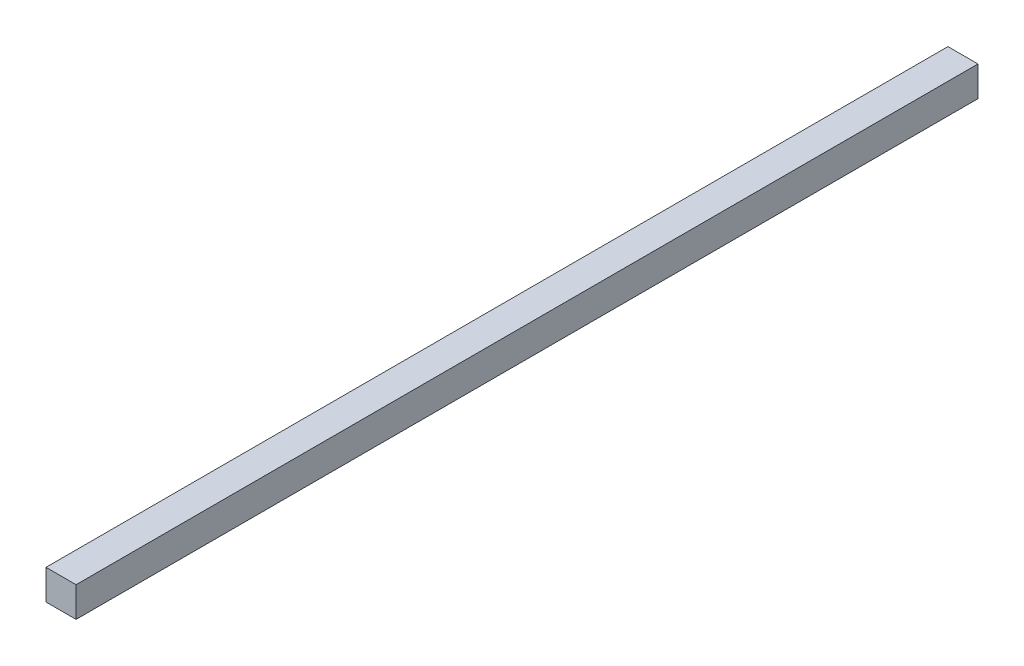
ISO-10303-21;
HEADER;
FILE_DESCRIPTION(('STEP AP214'),'2;1');
FILE_NAME('part.step','',(''),(''),'','','');
FILE_SCHEMA(('AUTOMOTIVE_DESIGN { 1 0 10303 214 1 1 1 1 }'));
ENDSEC;
DATA;
#1=APPLICATION_CONTEXT('core data for automotive mechanical design processes');
#2=APPLICATION_PROTOCOL_DEFINITION('international standard','automotive_design',2000,#1);
#3=PRODUCT_CONTEXT('',#1,'mechanical');
#4=PRODUCT('Part','Part','',(#3));
#5=PRODUCT_RELATED_PRODUCT_CATEGORY('part','',(#4));
#6=PRODUCT_DEFINITION_FORMATION('','',#4);
#7=PRODUCT_DEFINITION_CONTEXT('part definition',#1,'design');
#8=PRODUCT_DEFINITION('design','',#6,#7);
#9=PRODUCT_DEFINITION_SHAPE('','',#8);
#10=(LENGTH_UNIT() NAMED_UNIT(*) SI_UNIT(.MILLI.,.METRE.));
#11=(NAMED_UNIT(*) PLANE_ANGLE_UNIT() SI_UNIT($,.RADIAN.));
#12=(NAMED_UNIT(*) SI_UNIT($,.STERADIAN.) SOLID_ANGLE_UNIT());
#13=UNCERTAINTY_MEASURE_WITH_UNIT(LENGTH_MEASURE(1.E-05),#10,'distance_accuracy_value','');
#14=(GEOMETRIC_REPRESENTATION_CONTEXT(3) GLOBAL_UNCERTAINTY_ASSIGNED_CONTEXT((#13)) GLOBAL_UNIT_ASSIGNED_CONTEXT((#10,
#11,#12)) REPRESENTATION_CONTEXT('',''));
#15=CARTESIAN_POINT('',(0.,0.,0.));
#16=DIRECTION('',(0.,0.,1.));
#17=DIRECTION('',(1.,0.,0.));
#18=AXIS2_PLACEMENT_3D('',#15,#16,#17);
#19=CARTESIAN_POINT('',(0.,0.,600.));
#20=DIRECTION('',(1.,0.,0.));
#21=DIRECTION('',(0.,0.,-1.));
#22=AXIS2_PLACEMENT_3D('',#19,#20,#21);
#23=PLANE('',#22);
#24=DIRECTION('',(0.,-1.,0.));
#25=VECTOR('',#24,1.);
#26=CARTESIAN_POINT('',(0.,0.,0.));
#27=LINE('',#26,#25);
#28=CARTESIAN_POINT('',(0.,0.,0.));
#29=VERTEX_POINT('',#28);
#30=CARTESIAN_POINT('',(0.,-20.,0.));
#31=VERTEX_POINT('',#30);
#32=EDGE_CURVE('E95',#29,#31,#27,.T.);
#33=ORIENTED_EDGE('',*,*,#32,.T.);
#34=DIRECTION('',(0.,0.,-1.));
#35=VECTOR('',#34,1.);
#36=CARTESIAN_POINT('',(0.,-20.,600.));
#37=LINE('',#36,#35);
#38=CARTESIAN_POINT('',(0.,-20.,600.));
#39=VERTEX_POINT('',#38);
#40=EDGE_CURVE('E11',#39,#31,#37,.T.);
#41=ORIENTED_EDGE('',*,*,#40,.F.);
#42=DIRECTION('',(0.,-1.,0.));
#43=VECTOR('',#42,1.);
#44=CARTESIAN_POINT('',(0.,0.,600.));
#45=LINE('',#44,#43);
#46=CARTESIAN_POINT('',(0.,0.,600.));
#47=VERTEX_POINT('',#46);
#48=EDGE_CURVE('E83',#47,#39,#45,.T.);
#49=ORIENTED_EDGE('',*,*,#48,.F.);
#50=DIRECTION('',(0.,0.,-1.));
#51=VECTOR('',#50,1.);
#52=CARTESIAN_POINT('',(0.,0.,600.));
#53=LINE('',#52,#51);
#54=EDGE_CURVE('E91',#47,#29,#53,.T.);
#55=ORIENTED_EDGE('',*,*,#54,.T.);
#56=EDGE_LOOP('',(#33,#41,#49,#55));
#57=FACE_BOUND('',#56,.T.);
#58=ADVANCED_FACE('F32',(#57),#23,.F.);
#59=CARTESIAN_POINT('',(0.,-20.,600.));
#60=DIRECTION('',(0.,1.,0.));
#61=DIRECTION('',(0.,0.,1.));
#62=AXIS2_PLACEMENT_3D('',#59,#60,#61);
#63=PLANE('',#62);
#64=DIRECTION('',(1.,0.,0.));
#65=VECTOR('',#64,1.);
#66=CARTESIAN_POINT('',(0.,-20.,0.));
#67=LINE('',#66,#65);
#68=CARTESIAN_POINT('',(20.,-20.,0.));
#69=VERTEX_POINT('',#68);
#70=EDGE_CURVE('E87',#31,#69,#67,.T.);
#71=ORIENTED_EDGE('',*,*,#70,.T.);
#72=DIRECTION('',(0.,0.,-1.));
#73=VECTOR('',#72,1.);
#74=CARTESIAN_POINT('',(20.,-20.,600.));
#75=LINE('',#74,#73);
#76=CARTESIAN_POINT('',(20.,-20.,600.));
#77=VERTEX_POINT('',#76);
#78=EDGE_CURVE('E40',#77,#69,#75,.T.);
#79=ORIENTED_EDGE('',*,*,#78,.F.);
#80=DIRECTION('',(1.,0.,0.));
#81=VECTOR('',#80,1.);
#82=CARTESIAN_POINT('',(0.,-20.,600.));
#83=LINE('',#82,#81);
#84=EDGE_CURVE('E78',#39,#77,#83,.T.);
#85=ORIENTED_EDGE('',*,*,#84,.F.);
#86=ORIENTED_EDGE('',*,*,#40,.T.);
#87=EDGE_LOOP('',(#71,#79,#85,#86));
#88=FACE_BOUND('',#87,.T.);
#89=ADVANCED_FACE('F86',(#88),#63,.F.);
#90=CARTESIAN_POINT('',(20.,0.,600.));
#91=DIRECTION('',(-1.,0.,0.));
#92=DIRECTION('',(0.,-1.,0.));
#93=AXIS2_PLACEMENT_3D('',#90,#91,#92);
#94=PLANE('',#93);
#95=DIRECTION('',(0.,1.,0.));
#96=VECTOR('',#95,1.);
#97=CARTESIAN_POINT('',(20.,0.,0.));
#98=LINE('',#97,#96);
#99=CARTESIAN_POINT('',(20.,0.,0.));
#100=VERTEX_POINT('',#99);
#101=EDGE_CURVE('E65',#69,#100,#98,.T.);
#102=ORIENTED_EDGE('',*,*,#101,.T.);
#103=DIRECTION('',(0.,0.,-1.));
#104=VECTOR('',#103,1.);
#105=CARTESIAN_POINT('',(20.,0.,600.));
#106=LINE('',#105,#104);
#107=CARTESIAN_POINT('',(20.,0.,600.));
#108=VERTEX_POINT('',#107);
#109=EDGE_CURVE('E88',#108,#100,#106,.T.);
#110=ORIENTED_EDGE('',*,*,#109,.F.);
#111=DIRECTION('',(0.,1.,0.));
#112=VECTOR('',#111,1.);
#113=CARTESIAN_POINT('',(20.,0.,600.));
#114=LINE('',#113,#112);
#115=EDGE_CURVE('E81',#77,#108,#114,.T.);
#116=ORIENTED_EDGE('',*,*,#115,.F.);
#117=ORIENTED_EDGE('',*,*,#78,.T.);
#118=EDGE_LOOP('',(#102,#110,#116,#117));
#119=FACE_BOUND('',#118,.T.);
#120=ADVANCED_FACE('F89',(#119),#94,.F.);
#121=CARTESIAN_POINT('',(0.,0.,600.));
#122=DIRECTION('',(0.,-1.,0.));
#123=DIRECTION('',(0.,0.,-1.));
#124=AXIS2_PLACEMENT_3D('',#121,#122,#123);
#125=PLANE('',#124);
#126=DIRECTION('',(-1.,0.,0.));
#127=VECTOR('',#126,1.);
#128=CARTESIAN_POINT('',(0.,0.,0.));
#129=LINE('',#128,#127);
#130=EDGE_CURVE('E71',#100,#29,#129,.T.);
#131=ORIENTED_EDGE('',*,*,#130,.T.);
#132=ORIENTED_EDGE('',*,*,#54,.F.);
#133=DIRECTION('',(-1.,0.,0.));
#134=VECTOR('',#133,1.);
#135=CARTESIAN_POINT('',(0.,0.,600.));
#136=LINE('',#135,#134);
#137=EDGE_CURVE('E48',#108,#47,#136,.T.);
#138=ORIENTED_EDGE('',*,*,#137,.F.);
#139=ORIENTED_EDGE('',*,*,#109,.T.);
#140=EDGE_LOOP('',(#131,#132,#138,#139));
#141=FACE_BOUND('',#140,.T.);
#142=ADVANCED_FACE('F102',(#141),#125,.F.);
#143=CARTESIAN_POINT('',(0.,0.,600.));
#144=DIRECTION('',(0.,0.,1.));
#145=DIRECTION('',(1.,0.,0.));
#146=AXIS2_PLACEMENT_3D('',#143,#144,#145);
#147=PLANE('',#146);
#148=ORIENTED_EDGE('',*,*,#48,.T.);
#149=ORIENTED_EDGE('',*,*,#84,.T.);
#150=ORIENTED_EDGE('',*,*,#115,.T.);
#151=ORIENTED_EDGE('',*,*,#137,.T.);
#152=EDGE_LOOP('',(#148,#149,#150,#151));
#153=FACE_BOUND('',#152,.T.);
#154=ADVANCED_FACE('F79',(#153),#147,.T.);
#155=CARTESIAN_POINT('',(0.,0.,0.));
#156=DIRECTION('',(0.,0.,1.));
#157=DIRECTION('',(1.,0.,0.));
#158=AXIS2_PLACEMENT_3D('',#155,#156,#157);
#159=PLANE('',#158);
#160=ORIENTED_EDGE('',*,*,#32,.F.);
#161=ORIENTED_EDGE('',*,*,#130,.F.);
#162=ORIENTED_EDGE('',*,*,#101,.F.);
#163=ORIENTED_EDGE('',*,*,#70,.F.);
#164=EDGE_LOOP('',(#160,#161,#162,#163));
#165=FACE_BOUND('',#164,.T.);
#166=ADVANCED_FACE('F105',(#165),#159,.F.);
#167=CLOSED_SHELL('',(#58,#89,#120,#142,#154,#166));
#168=MANIFOLD_SOLID_BREP('B2',#167);
#169=ADVANCED_BREP_SHAPE_REPRESENTATION('',(#18,#168),#14);
#170=SHAPE_DEFINITION_REPRESENTATION(#9,#169);
ENDSEC;
END-ISO-10303-21;
